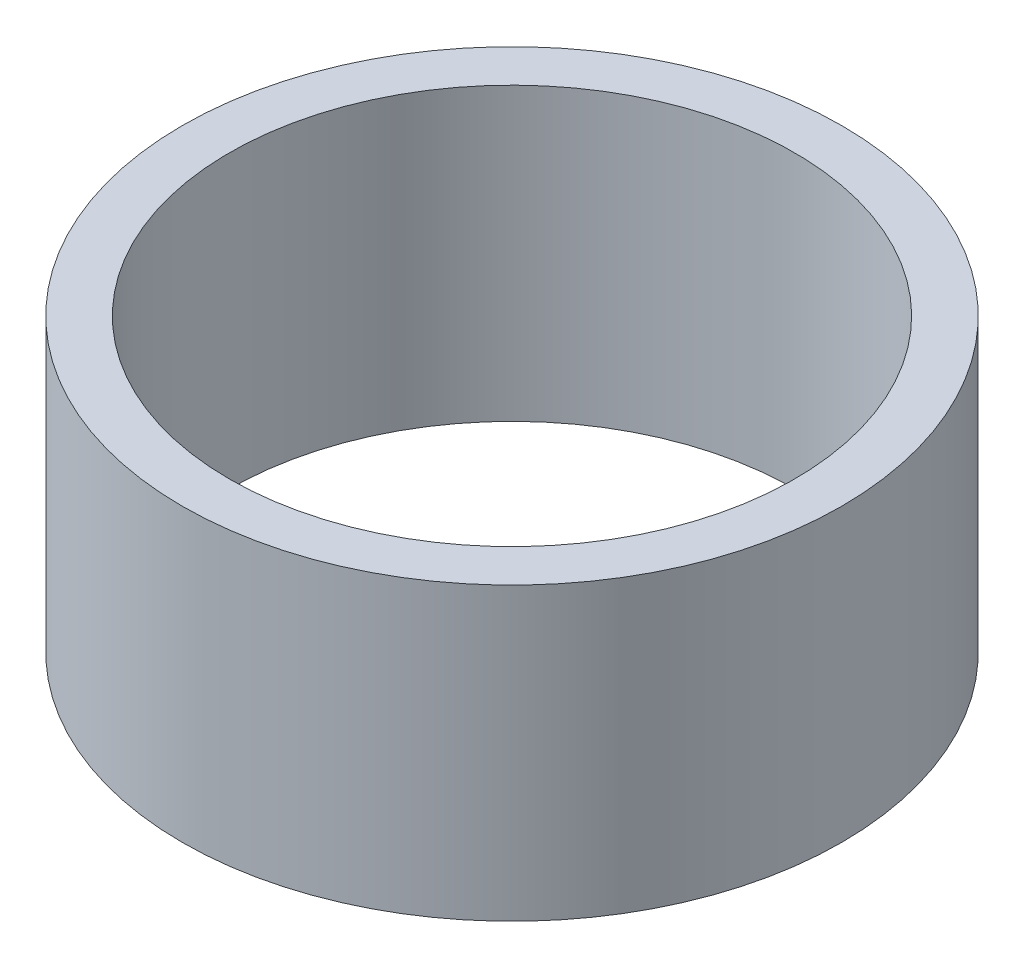
ISO-10303-21;
HEADER;
FILE_DESCRIPTION(('STEP AP214'),'2;1');
FILE_NAME('part.step','',(''),(''),'','','');
FILE_SCHEMA(('AUTOMOTIVE_DESIGN { 1 0 10303 214 1 1 1 1 }'));
ENDSEC;
DATA;
#1=APPLICATION_CONTEXT('core data for automotive mechanical design processes');
#2=APPLICATION_PROTOCOL_DEFINITION('international standard','automotive_design',2000,#1);
#3=PRODUCT_CONTEXT('',#1,'mechanical');
#4=PRODUCT('Part','Part','',(#3));
#5=PRODUCT_RELATED_PRODUCT_CATEGORY('part','',(#4));
#6=PRODUCT_DEFINITION_FORMATION('','',#4);
#7=PRODUCT_DEFINITION_CONTEXT('part definition',#1,'design');
#8=PRODUCT_DEFINITION('design','',#6,#7);
#9=PRODUCT_DEFINITION_SHAPE('','',#8);
#10=(LENGTH_UNIT() NAMED_UNIT(*) SI_UNIT(.MILLI.,.METRE.));
#11=(NAMED_UNIT(*) PLANE_ANGLE_UNIT() SI_UNIT($,.RADIAN.));
#12=(NAMED_UNIT(*) SI_UNIT($,.STERADIAN.) SOLID_ANGLE_UNIT());
#13=UNCERTAINTY_MEASURE_WITH_UNIT(LENGTH_MEASURE(1.E-05),#10,'distance_accuracy_value','');
#14=(GEOMETRIC_REPRESENTATION_CONTEXT(3) GLOBAL_UNCERTAINTY_ASSIGNED_CONTEXT((#13)) GLOBAL_UNIT_ASSIGNED_CONTEXT((#10,
#11,#12)) REPRESENTATION_CONTEXT('',''));
#15=CARTESIAN_POINT('',(0.,0.,0.));
#16=DIRECTION('',(0.,0.,1.));
#17=DIRECTION('',(1.,0.,0.));
#18=AXIS2_PLACEMENT_3D('',#15,#16,#17);
#19=CARTESIAN_POINT('',(0.,34.,0.));
#20=DIRECTION('',(0.,1.,0.));
#21=DIRECTION('',(0.,0.,1.));
#22=AXIS2_PLACEMENT_3D('',#19,#20,#21);
#23=PLANE('',#22);
#24=CARTESIAN_POINT('',(0.,34.,0.));
#25=DIRECTION('',(0.,1.,0.));
#26=DIRECTION('',(0.,0.,1.));
#27=AXIS2_PLACEMENT_3D('',#24,#25,#26);
#28=CIRCLE('',#27,38.5);
#29=CARTESIAN_POINT('',(0.,34.,38.5));
#30=VERTEX_POINT('',#29);
#31=EDGE_CURVE('E10',#30,#30,#28,.T.);
#32=ORIENTED_EDGE('',*,*,#31,.T.);
#33=EDGE_LOOP('',(#32));
#34=FACE_BOUND('',#33,.T.);
#35=CARTESIAN_POINT('',(0.,34.,0.));
#36=DIRECTION('',(0.,1.,0.));
#37=DIRECTION('',(0.,0.,1.));
#38=AXIS2_PLACEMENT_3D('',#35,#36,#37);
#39=CIRCLE('',#38,33.);
#40=CARTESIAN_POINT('',(0.,34.,33.));
#41=VERTEX_POINT('',#40);
#42=EDGE_CURVE('E50',#41,#41,#39,.T.);
#43=ORIENTED_EDGE('',*,*,#42,.F.);
#44=EDGE_LOOP('',(#43));
#45=FACE_BOUND('',#44,.T.);
#46=ADVANCED_FACE('F37',(#34,#45),#23,.T.);
#47=CARTESIAN_POINT('',(0.,0.,0.));
#48=DIRECTION('',(0.,1.,0.));
#49=DIRECTION('',(0.,0.,1.));
#50=AXIS2_PLACEMENT_3D('',#47,#48,#49);
#51=PLANE('',#50);
#52=CARTESIAN_POINT('',(0.,0.,0.));
#53=DIRECTION('',(0.,1.,0.));
#54=DIRECTION('',(0.,0.,1.));
#55=AXIS2_PLACEMENT_3D('',#52,#53,#54);
#56=CIRCLE('',#55,38.5);
#57=CARTESIAN_POINT('',(0.,0.,38.5));
#58=VERTEX_POINT('',#57);
#59=EDGE_CURVE('E41',#58,#58,#56,.T.);
#60=ORIENTED_EDGE('',*,*,#59,.F.);
#61=EDGE_LOOP('',(#60));
#62=FACE_BOUND('',#61,.T.);
#63=CARTESIAN_POINT('',(0.,0.,0.));
#64=DIRECTION('',(0.,1.,0.));
#65=DIRECTION('',(0.,0.,1.));
#66=AXIS2_PLACEMENT_3D('',#63,#64,#65);
#67=CIRCLE('',#66,33.);
#68=CARTESIAN_POINT('',(0.,0.,33.));
#69=VERTEX_POINT('',#68);
#70=EDGE_CURVE('E52',#69,#69,#67,.T.);
#71=ORIENTED_EDGE('',*,*,#70,.T.);
#72=EDGE_LOOP('',(#71));
#73=FACE_BOUND('',#72,.T.);
#74=ADVANCED_FACE('F64',(#62,#73),#51,.F.);
#75=CARTESIAN_POINT('',(0.,34.,0.));
#76=DIRECTION('',(0.,-1.,0.));
#77=DIRECTION('',(0.,0.,-1.));
#78=AXIS2_PLACEMENT_3D('',#75,#76,#77);
#79=CYLINDRICAL_SURFACE('',#78,38.5);
#80=ORIENTED_EDGE('',*,*,#31,.F.);
#81=EDGE_LOOP('',(#80));
#82=FACE_BOUND('',#81,.T.);
#83=ORIENTED_EDGE('',*,*,#59,.T.);
#84=EDGE_LOOP('',(#83));
#85=FACE_BOUND('',#84,.T.);
#86=ADVANCED_FACE('F39',(#82,#85),#79,.T.);
#87=CARTESIAN_POINT('',(0.,34.,0.));
#88=DIRECTION('',(0.,-1.,0.));
#89=DIRECTION('',(0.,0.,-1.));
#90=AXIS2_PLACEMENT_3D('',#87,#88,#89);
#91=CYLINDRICAL_SURFACE('',#90,33.);
#92=ORIENTED_EDGE('',*,*,#42,.T.);
#93=EDGE_LOOP('',(#92));
#94=FACE_BOUND('',#93,.T.);
#95=ORIENTED_EDGE('',*,*,#70,.F.);
#96=EDGE_LOOP('',(#95));
#97=FACE_BOUND('',#96,.T.);
#98=ADVANCED_FACE('F60',(#94,#97),#91,.F.);
#99=CLOSED_SHELL('',(#46,#74,#86,#98));
#100=MANIFOLD_SOLID_BREP('B2',#99);
#101=ADVANCED_BREP_SHAPE_REPRESENTATION('',(#18,#100),#14);
#102=SHAPE_DEFINITION_REPRESENTATION(#9,#101);
ENDSEC;
END-ISO-10303-21;
